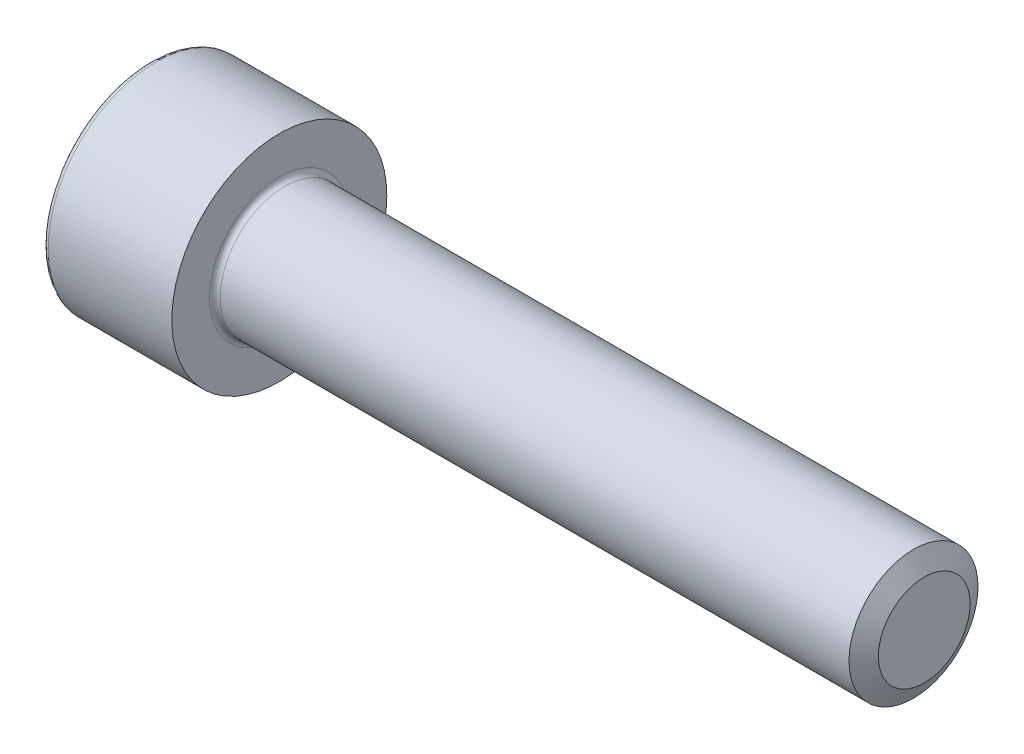
ISO-10303-21;
HEADER;
FILE_DESCRIPTION(('STEP AP214'),'2;1');
FILE_NAME('part.step','',(''),(''),'','','');
FILE_SCHEMA(('AUTOMOTIVE_DESIGN { 1 0 10303 214 1 1 1 1 }'));
ENDSEC;
DATA;
#1=APPLICATION_CONTEXT('core data for automotive mechanical design processes');
#2=APPLICATION_PROTOCOL_DEFINITION('international standard','automotive_design',2000,#1);
#3=PRODUCT_CONTEXT('',#1,'mechanical');
#4=PRODUCT('Part','Part','',(#3));
#5=PRODUCT_RELATED_PRODUCT_CATEGORY('part','',(#4));
#6=PRODUCT_DEFINITION_FORMATION('','',#4);
#7=PRODUCT_DEFINITION_CONTEXT('part definition',#1,'design');
#8=PRODUCT_DEFINITION('design','',#6,#7);
#9=PRODUCT_DEFINITION_SHAPE('','',#8);
#10=(LENGTH_UNIT() NAMED_UNIT(*) SI_UNIT(.MILLI.,.METRE.));
#11=(NAMED_UNIT(*) PLANE_ANGLE_UNIT() SI_UNIT($,.RADIAN.));
#12=(NAMED_UNIT(*) SI_UNIT($,.STERADIAN.) SOLID_ANGLE_UNIT());
#13=UNCERTAINTY_MEASURE_WITH_UNIT(LENGTH_MEASURE(1.E-05),#10,'distance_accuracy_value','');
#14=(GEOMETRIC_REPRESENTATION_CONTEXT(3) GLOBAL_UNCERTAINTY_ASSIGNED_CONTEXT((#13)) GLOBAL_UNIT_ASSIGNED_CONTEXT((#10,
#11,#12)) REPRESENTATION_CONTEXT('',''));
#15=CARTESIAN_POINT('',(0.,0.,0.));
#16=DIRECTION('',(0.,0.,1.));
#17=DIRECTION('',(1.,0.,0.));
#18=AXIS2_PLACEMENT_3D('',#15,#16,#17);
#19=CARTESIAN_POINT('',(0.,0.,0.));
#20=DIRECTION('',(1.,0.,0.));
#21=DIRECTION('',(0.,0.,-1.));
#22=AXIS2_PLACEMENT_3D('',#19,#20,#21);
#23=CYLINDRICAL_SURFACE('',#22,3.);
#24=CARTESIAN_POINT('',(6.25,0.,0.));
#25=DIRECTION('',(1.,0.,0.));
#26=DIRECTION('',(0.,0.,-1.));
#27=AXIS2_PLACEMENT_3D('',#24,#25,#26);
#28=CIRCLE('',#27,3.);
#29=CARTESIAN_POINT('',(6.25,0.,-3.));
#30=VERTEX_POINT('',#29);
#31=EDGE_CURVE('E141',#30,#30,#28,.T.);
#32=ORIENTED_EDGE('',*,*,#31,.T.);
#33=EDGE_LOOP('',(#32));
#34=FACE_BOUND('',#33,.T.);
#35=CARTESIAN_POINT('',(35.5,0.,0.));
#36=DIRECTION('',(-1.,0.,0.));
#37=DIRECTION('',(0.,0.,1.));
#38=AXIS2_PLACEMENT_3D('',#35,#36,#37);
#39=CIRCLE('',#38,3.);
#40=CARTESIAN_POINT('',(35.5,0.,3.));
#41=VERTEX_POINT('',#40);
#42=EDGE_CURVE('E311',#41,#41,#39,.T.);
#43=ORIENTED_EDGE('',*,*,#42,.T.);
#44=EDGE_LOOP('',(#43));
#45=FACE_BOUND('',#44,.T.);
#46=ADVANCED_FACE('F38',(#34,#45),#23,.T.);
#47=CARTESIAN_POINT('',(0.,0.,0.));
#48=DIRECTION('',(-1.,0.,0.));
#49=DIRECTION('',(0.,0.,1.));
#50=AXIS2_PLACEMENT_3D('',#47,#48,#49);
#51=PLANE('',#50);
#52=CARTESIAN_POINT('',(0.,0.,0.));
#53=DIRECTION('',(-1.,0.,0.));
#54=DIRECTION('',(0.,0.,1.));
#55=AXIS2_PLACEMENT_3D('',#52,#53,#54);
#56=CIRCLE('',#55,4.75);
#57=CARTESIAN_POINT('',(0.,0.,4.75));
#58=VERTEX_POINT('',#57);
#59=EDGE_CURVE('E11',#58,#58,#56,.T.);
#60=ORIENTED_EDGE('',*,*,#59,.T.);
#61=EDGE_LOOP('',(#60));
#62=FACE_BOUND('',#61,.T.);
#63=DIRECTION('',(0.,0.5,0.866025403784439));
#64=VECTOR('',#63,1.);
#65=CARTESIAN_POINT('',(0.,-2.86,0.));
#66=LINE('',#65,#64);
#67=CARTESIAN_POINT('',(0.,-2.86,0.));
#68=VERTEX_POINT('',#67);
#69=CARTESIAN_POINT('',(0.,-1.43,2.47683265482349));
#70=VERTEX_POINT('',#69);
#71=EDGE_CURVE('E53',#68,#70,#66,.T.);
#72=ORIENTED_EDGE('',*,*,#71,.F.);
#73=DIRECTION('',(0.,-0.5,0.866025403784439));
#74=VECTOR('',#73,1.);
#75=CARTESIAN_POINT('',(0.,-1.43,-2.47683265482349));
#76=LINE('',#75,#74);
#77=CARTESIAN_POINT('',(0.,-1.43,-2.47683265482349));
#78=VERTEX_POINT('',#77);
#79=EDGE_CURVE('E137',#78,#68,#76,.T.);
#80=ORIENTED_EDGE('',*,*,#79,.F.);
#81=DIRECTION('',(0.,-1.,0.));
#82=VECTOR('',#81,1.);
#83=CARTESIAN_POINT('',(0.,1.43,-2.47683265482349));
#84=LINE('',#83,#82);
#85=CARTESIAN_POINT('',(0.,1.43,-2.47683265482349));
#86=VERTEX_POINT('',#85);
#87=EDGE_CURVE('E135',#86,#78,#84,.T.);
#88=ORIENTED_EDGE('',*,*,#87,.F.);
#89=DIRECTION('',(0.,-0.5,-0.866025403784439));
#90=VECTOR('',#89,1.);
#91=CARTESIAN_POINT('',(0.,2.86,0.));
#92=LINE('',#91,#90);
#93=CARTESIAN_POINT('',(0.,2.86,0.));
#94=VERTEX_POINT('',#93);
#95=EDGE_CURVE('E101',#94,#86,#92,.T.);
#96=ORIENTED_EDGE('',*,*,#95,.F.);
#97=DIRECTION('',(0.,0.5,-0.866025403784439));
#98=VECTOR('',#97,1.);
#99=CARTESIAN_POINT('',(0.,1.43,2.47683265482349));
#100=LINE('',#99,#98);
#101=CARTESIAN_POINT('',(0.,1.43,2.47683265482349));
#102=VERTEX_POINT('',#101);
#103=EDGE_CURVE('E131',#102,#94,#100,.T.);
#104=ORIENTED_EDGE('',*,*,#103,.F.);
#105=DIRECTION('',(0.,1.,0.));
#106=VECTOR('',#105,1.);
#107=CARTESIAN_POINT('',(0.,-1.43,2.47683265482349));
#108=LINE('',#107,#106);
#109=EDGE_CURVE('E127',#70,#102,#108,.T.);
#110=ORIENTED_EDGE('',*,*,#109,.F.);
#111=EDGE_LOOP('',(#72,#80,#88,#96,#104,#110));
#112=FACE_BOUND('',#111,.T.);
#113=ADVANCED_FACE('F175',(#62,#112),#51,.T.);
#114=CARTESIAN_POINT('',(0.,0.,0.));
#115=DIRECTION('',(1.,0.,0.));
#116=DIRECTION('',(0.,0.,-1.));
#117=AXIS2_PLACEMENT_3D('',#114,#115,#116);
#118=CYLINDRICAL_SURFACE('',#117,5.);
#119=CARTESIAN_POINT('',(0.25,0.,0.));
#120=DIRECTION('',(-1.,0.,0.));
#121=DIRECTION('',(0.,0.,1.));
#122=AXIS2_PLACEMENT_3D('',#119,#120,#121);
#123=CIRCLE('',#122,5.);
#124=CARTESIAN_POINT('',(0.25,0.,5.));
#125=VERTEX_POINT('',#124);
#126=EDGE_CURVE('E46',#125,#125,#123,.F.);
#127=ORIENTED_EDGE('',*,*,#126,.T.);
#128=EDGE_LOOP('',(#127));
#129=FACE_BOUND('',#128,.T.);
#130=CARTESIAN_POINT('',(6.,0.,0.));
#131=DIRECTION('',(1.,0.,0.));
#132=DIRECTION('',(0.,0.,-1.));
#133=AXIS2_PLACEMENT_3D('',#130,#131,#132);
#134=CIRCLE('',#133,5.);
#135=CARTESIAN_POINT('',(6.,0.,-5.));
#136=VERTEX_POINT('',#135);
#137=EDGE_CURVE('E152',#136,#136,#134,.T.);
#138=ORIENTED_EDGE('',*,*,#137,.F.);
#139=EDGE_LOOP('',(#138));
#140=FACE_BOUND('',#139,.T.);
#141=ADVANCED_FACE('F158',(#129,#140),#118,.T.);
#142=CARTESIAN_POINT('',(6.,5.,0.));
#143=DIRECTION('',(1.,0.,0.));
#144=DIRECTION('',(0.,0.,-1.));
#145=AXIS2_PLACEMENT_3D('',#142,#143,#144);
#146=PLANE('',#145);
#147=ORIENTED_EDGE('',*,*,#137,.T.);
#148=EDGE_LOOP('',(#147));
#149=FACE_BOUND('',#148,.T.);
#150=CARTESIAN_POINT('',(6.,0.,0.));
#151=DIRECTION('',(1.,0.,0.));
#152=DIRECTION('',(0.,0.,-1.));
#153=AXIS2_PLACEMENT_3D('',#150,#151,#152);
#154=CIRCLE('',#153,3.25);
#155=CARTESIAN_POINT('',(6.,0.,-3.25));
#156=VERTEX_POINT('',#155);
#157=EDGE_CURVE('E149',#156,#156,#154,.T.);
#158=ORIENTED_EDGE('',*,*,#157,.F.);
#159=EDGE_LOOP('',(#158));
#160=FACE_BOUND('',#159,.T.);
#161=ADVANCED_FACE('F190',(#149,#160),#146,.T.);
#162=CARTESIAN_POINT('',(6.25,0.,0.));
#163=DIRECTION('',(1.,0.,0.));
#164=DIRECTION('',(0.,0.,-1.));
#165=AXIS2_PLACEMENT_3D('',#162,#163,#164);
#166=TOROIDAL_SURFACE('',#165,3.25,0.25);
#167=ORIENTED_EDGE('',*,*,#157,.T.);
#168=EDGE_LOOP('',(#167));
#169=FACE_BOUND('',#168,.T.);
#170=ORIENTED_EDGE('',*,*,#31,.F.);
#171=EDGE_LOOP('',(#170));
#172=FACE_BOUND('',#171,.T.);
#173=ADVANCED_FACE('F186',(#169,#172),#166,.F.);
#174=CARTESIAN_POINT('',(3.,-2.86,0.));
#175=DIRECTION('',(0.,-0.866025403784439,0.5));
#176=DIRECTION('',(0.,-0.5,-0.866025403784439));
#177=AXIS2_PLACEMENT_3D('',#174,#175,#176);
#178=PLANE('',#177);
#179=ORIENTED_EDGE('',*,*,#71,.T.);
#180=DIRECTION('',(-1.,0.,0.));
#181=VECTOR('',#180,1.);
#182=CARTESIAN_POINT('',(3.,-1.43,2.47683265482349));
#183=LINE('',#182,#181);
#184=CARTESIAN_POINT('',(3.,-1.43,2.47683265482349));
#185=VERTEX_POINT('',#184);
#186=EDGE_CURVE('E83',#185,#70,#183,.T.);
#187=ORIENTED_EDGE('',*,*,#186,.F.);
#188=DIRECTION('',(0.,0.5,0.866025403784439));
#189=VECTOR('',#188,1.);
#190=CARTESIAN_POINT('',(3.,-2.86,0.));
#191=LINE('',#190,#189);
#192=CARTESIAN_POINT('',(3.,-2.86,0.));
#193=VERTEX_POINT('',#192);
#194=EDGE_CURVE('E139',#193,#185,#191,.T.);
#195=ORIENTED_EDGE('',*,*,#194,.F.);
#196=DIRECTION('',(-1.,0.,0.));
#197=VECTOR('',#196,1.);
#198=CARTESIAN_POINT('',(3.,-2.86,0.));
#199=LINE('',#198,#197);
#200=EDGE_CURVE('E61',#193,#68,#199,.T.);
#201=ORIENTED_EDGE('',*,*,#200,.T.);
#202=EDGE_LOOP('',(#179,#187,#195,#201));
#203=FACE_BOUND('',#202,.T.);
#204=ADVANCED_FACE('F189',(#203),#178,.F.);
#205=CARTESIAN_POINT('',(3.,-1.43,-2.47683265482349));
#206=DIRECTION('',(0.,-0.866025403784439,-0.5));
#207=DIRECTION('',(0.,0.5,-0.866025403784439));
#208=AXIS2_PLACEMENT_3D('',#205,#206,#207);
#209=PLANE('',#208);
#210=ORIENTED_EDGE('',*,*,#79,.T.);
#211=ORIENTED_EDGE('',*,*,#200,.F.);
#212=DIRECTION('',(0.,-0.5,0.866025403784439));
#213=VECTOR('',#212,1.);
#214=CARTESIAN_POINT('',(3.,-1.43,-2.47683265482349));
#215=LINE('',#214,#213);
#216=CARTESIAN_POINT('',(3.,-1.43,-2.47683265482349));
#217=VERTEX_POINT('',#216);
#218=EDGE_CURVE('E113',#217,#193,#215,.T.);
#219=ORIENTED_EDGE('',*,*,#218,.F.);
#220=DIRECTION('',(-1.,0.,0.));
#221=VECTOR('',#220,1.);
#222=CARTESIAN_POINT('',(3.,-1.43,-2.47683265482349));
#223=LINE('',#222,#221);
#224=EDGE_CURVE('E105',#217,#78,#223,.T.);
#225=ORIENTED_EDGE('',*,*,#224,.T.);
#226=EDGE_LOOP('',(#210,#211,#219,#225));
#227=FACE_BOUND('',#226,.T.);
#228=ADVANCED_FACE('F214',(#227),#209,.F.);
#229=CARTESIAN_POINT('',(3.,1.43,-2.47683265482349));
#230=DIRECTION('',(0.,0.,-1.));
#231=DIRECTION('',(-1.,0.,0.));
#232=AXIS2_PLACEMENT_3D('',#229,#230,#231);
#233=PLANE('',#232);
#234=ORIENTED_EDGE('',*,*,#87,.T.);
#235=ORIENTED_EDGE('',*,*,#224,.F.);
#236=DIRECTION('',(0.,-1.,0.));
#237=VECTOR('',#236,1.);
#238=CARTESIAN_POINT('',(3.,1.43,-2.47683265482349));
#239=LINE('',#238,#237);
#240=CARTESIAN_POINT('',(3.,1.43,-2.47683265482349));
#241=VERTEX_POINT('',#240);
#242=EDGE_CURVE('E109',#241,#217,#239,.T.);
#243=ORIENTED_EDGE('',*,*,#242,.F.);
#244=DIRECTION('',(-1.,0.,0.));
#245=VECTOR('',#244,1.);
#246=CARTESIAN_POINT('',(3.,1.43,-2.47683265482349));
#247=LINE('',#246,#245);
#248=EDGE_CURVE('E94',#241,#86,#247,.T.);
#249=ORIENTED_EDGE('',*,*,#248,.T.);
#250=EDGE_LOOP('',(#234,#235,#243,#249));
#251=FACE_BOUND('',#250,.T.);
#252=ADVANCED_FACE('F110',(#251),#233,.F.);
#253=CARTESIAN_POINT('',(3.,2.86,0.));
#254=DIRECTION('',(0.,0.866025403784439,-0.5));
#255=DIRECTION('',(0.,0.5,0.866025403784439));
#256=AXIS2_PLACEMENT_3D('',#253,#254,#255);
#257=PLANE('',#256);
#258=ORIENTED_EDGE('',*,*,#95,.T.);
#259=ORIENTED_EDGE('',*,*,#248,.F.);
#260=DIRECTION('',(0.,-0.5,-0.866025403784439));
#261=VECTOR('',#260,1.);
#262=CARTESIAN_POINT('',(3.,2.86,0.));
#263=LINE('',#262,#261);
#264=CARTESIAN_POINT('',(3.,2.86,0.));
#265=VERTEX_POINT('',#264);
#266=EDGE_CURVE('E98',#265,#241,#263,.T.);
#267=ORIENTED_EDGE('',*,*,#266,.F.);
#268=DIRECTION('',(-1.,0.,0.));
#269=VECTOR('',#268,1.);
#270=CARTESIAN_POINT('',(3.,2.86,0.));
#271=LINE('',#270,#269);
#272=EDGE_CURVE('E106',#265,#94,#271,.T.);
#273=ORIENTED_EDGE('',*,*,#272,.T.);
#274=EDGE_LOOP('',(#258,#259,#267,#273));
#275=FACE_BOUND('',#274,.T.);
#276=ADVANCED_FACE('F96',(#275),#257,.F.);
#277=CARTESIAN_POINT('',(3.,1.43,2.47683265482349));
#278=DIRECTION('',(0.,0.866025403784439,0.5));
#279=DIRECTION('',(0.,-0.5,0.866025403784439));
#280=AXIS2_PLACEMENT_3D('',#277,#278,#279);
#281=PLANE('',#280);
#282=ORIENTED_EDGE('',*,*,#103,.T.);
#283=ORIENTED_EDGE('',*,*,#272,.F.);
#284=DIRECTION('',(0.,0.5,-0.866025403784439));
#285=VECTOR('',#284,1.);
#286=CARTESIAN_POINT('',(3.,1.43,2.47683265482349));
#287=LINE('',#286,#285);
#288=CARTESIAN_POINT('',(3.,1.43,2.47683265482349));
#289=VERTEX_POINT('',#288);
#290=EDGE_CURVE('E119',#289,#265,#287,.T.);
#291=ORIENTED_EDGE('',*,*,#290,.F.);
#292=DIRECTION('',(-1.,0.,0.));
#293=VECTOR('',#292,1.);
#294=CARTESIAN_POINT('',(3.,1.43,2.47683265482349));
#295=LINE('',#294,#293);
#296=EDGE_CURVE('E144',#289,#102,#295,.T.);
#297=ORIENTED_EDGE('',*,*,#296,.T.);
#298=EDGE_LOOP('',(#282,#283,#291,#297));
#299=FACE_BOUND('',#298,.T.);
#300=ADVANCED_FACE('F232',(#299),#281,.F.);
#301=CARTESIAN_POINT('',(3.,-1.43,2.47683265482349));
#302=DIRECTION('',(0.,0.,1.));
#303=DIRECTION('',(0.,-1.,0.));
#304=AXIS2_PLACEMENT_3D('',#301,#302,#303);
#305=PLANE('',#304);
#306=ORIENTED_EDGE('',*,*,#109,.T.);
#307=ORIENTED_EDGE('',*,*,#296,.F.);
#308=DIRECTION('',(0.,1.,0.));
#309=VECTOR('',#308,1.);
#310=CARTESIAN_POINT('',(3.,-1.43,2.47683265482349));
#311=LINE('',#310,#309);
#312=EDGE_CURVE('E121',#185,#289,#311,.T.);
#313=ORIENTED_EDGE('',*,*,#312,.F.);
#314=ORIENTED_EDGE('',*,*,#186,.T.);
#315=EDGE_LOOP('',(#306,#307,#313,#314));
#316=FACE_BOUND('',#315,.T.);
#317=ADVANCED_FACE('F171',(#316),#305,.F.);
#318=CARTESIAN_POINT('',(3.,-1.43,2.47683265482349));
#319=DIRECTION('',(-1.,0.,0.));
#320=DIRECTION('',(0.,0.,1.));
#321=AXIS2_PLACEMENT_3D('',#318,#319,#320);
#322=PLANE('',#321);
#323=ORIENTED_EDGE('',*,*,#194,.T.);
#324=ORIENTED_EDGE('',*,*,#312,.T.);
#325=ORIENTED_EDGE('',*,*,#290,.T.);
#326=ORIENTED_EDGE('',*,*,#266,.T.);
#327=ORIENTED_EDGE('',*,*,#242,.T.);
#328=ORIENTED_EDGE('',*,*,#218,.T.);
#329=EDGE_LOOP('',(#323,#324,#325,#326,#327,#328));
#330=FACE_BOUND('',#329,.T.);
#331=ADVANCED_FACE('F116',(#330),#322,.T.);
#332=CARTESIAN_POINT('',(0.25,0.,0.));
#333=DIRECTION('',(-1.,0.,0.));
#334=DIRECTION('',(0.,0.,1.));
#335=AXIS2_PLACEMENT_3D('',#332,#333,#334);
#336=TOROIDAL_SURFACE('',#335,4.75,0.25);
#337=ORIENTED_EDGE('',*,*,#59,.F.);
#338=EDGE_LOOP('',(#337));
#339=FACE_BOUND('',#338,.T.);
#340=ORIENTED_EDGE('',*,*,#126,.F.);
#341=EDGE_LOOP('',(#340));
#342=FACE_BOUND('',#341,.T.);
#343=ADVANCED_FACE('F40',(#339,#342),#336,.T.);
#344=CARTESIAN_POINT('',(35.5,0.,0.));
#345=DIRECTION('',(-1.,0.,0.));
#346=DIRECTION('',(0.,0.,1.));
#347=AXIS2_PLACEMENT_3D('',#344,#345,#346);
#348=CONICAL_SURFACE('',#347,3.,1.04718484902493);
#349=CARTESIAN_POINT('',(36.,0.,0.));
#350=DIRECTION('',(-1.,0.,0.));
#351=DIRECTION('',(0.,0.,1.));
#352=AXIS2_PLACEMENT_3D('',#349,#350,#351);
#353=CIRCLE('',#352,2.134);
#354=CARTESIAN_POINT('',(36.,0.,2.134));
#355=VERTEX_POINT('',#354);
#356=EDGE_CURVE('E128',#355,#355,#353,.T.);
#357=ORIENTED_EDGE('',*,*,#356,.T.);
#358=EDGE_LOOP('',(#357));
#359=FACE_BOUND('',#358,.T.);
#360=ORIENTED_EDGE('',*,*,#42,.F.);
#361=EDGE_LOOP('',(#360));
#362=FACE_BOUND('',#361,.T.);
#363=ADVANCED_FACE('F162',(#359,#362),#348,.T.);
#364=CARTESIAN_POINT('',(36.,3.,0.));
#365=DIRECTION('',(1.,0.,0.));
#366=DIRECTION('',(0.,0.,-1.));
#367=AXIS2_PLACEMENT_3D('',#364,#365,#366);
#368=PLANE('',#367);
#369=ORIENTED_EDGE('',*,*,#356,.F.);
#370=EDGE_LOOP('',(#369));
#371=FACE_BOUND('',#370,.T.);
#372=ADVANCED_FACE('F168',(#371),#368,.T.);
#373=CLOSED_SHELL('',(#46,#113,#141,#161,#173,#204,#228,#252,#276,#300,#317,#331,#343,#363,#372));
#374=MANIFOLD_SOLID_BREP('B2',#373);
#375=ADVANCED_BREP_SHAPE_REPRESENTATION('',(#18,#374),#14);
#376=SHAPE_DEFINITION_REPRESENTATION(#9,#375);
ENDSEC;
END-ISO-10303-21;
